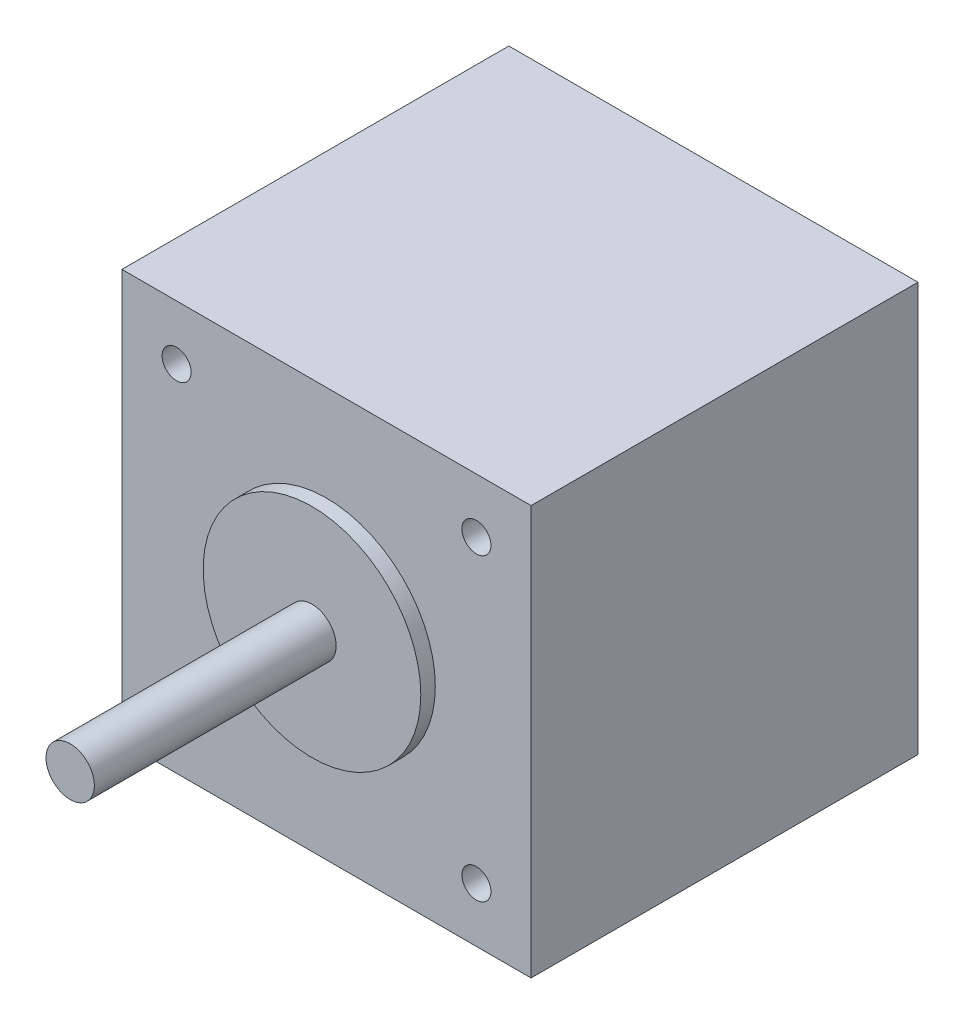
ISO-10303-21;
HEADER;
FILE_DESCRIPTION(('STEP AP214'),'2;1');
FILE_NAME('part.step','',(''),(''),'','','');
FILE_SCHEMA(('AUTOMOTIVE_DESIGN { 1 0 10303 214 1 1 1 1 }'));
ENDSEC;
DATA;
#1=APPLICATION_CONTEXT('core data for automotive mechanical design processes');
#2=APPLICATION_PROTOCOL_DEFINITION('international standard','automotive_design',2000,#1);
#3=PRODUCT_CONTEXT('',#1,'mechanical');
#4=PRODUCT('Part','Part','',(#3));
#5=PRODUCT_RELATED_PRODUCT_CATEGORY('part','',(#4));
#6=PRODUCT_DEFINITION_FORMATION('','',#4);
#7=PRODUCT_DEFINITION_CONTEXT('part definition',#1,'design');
#8=PRODUCT_DEFINITION('design','',#6,#7);
#9=PRODUCT_DEFINITION_SHAPE('','',#8);
#10=(LENGTH_UNIT() NAMED_UNIT(*) SI_UNIT(.MILLI.,.METRE.));
#11=(NAMED_UNIT(*) PLANE_ANGLE_UNIT() SI_UNIT($,.RADIAN.));
#12=(NAMED_UNIT(*) SI_UNIT($,.STERADIAN.) SOLID_ANGLE_UNIT());
#13=UNCERTAINTY_MEASURE_WITH_UNIT(LENGTH_MEASURE(1.E-05),#10,'distance_accuracy_value','');
#14=(GEOMETRIC_REPRESENTATION_CONTEXT(3) GLOBAL_UNCERTAINTY_ASSIGNED_CONTEXT((#13)) GLOBAL_UNIT_ASSIGNED_CONTEXT((#10,
#11,#12)) REPRESENTATION_CONTEXT('',''));
#15=CARTESIAN_POINT('',(0.,0.,0.));
#16=DIRECTION('',(0.,0.,1.));
#17=DIRECTION('',(1.,0.,0.));
#18=AXIS2_PLACEMENT_3D('',#15,#16,#17);
#19=CARTESIAN_POINT('',(-21.15,-21.15,-40.));
#20=DIRECTION('',(0.,-1.,0.));
#21=DIRECTION('',(0.,0.,-1.));
#22=AXIS2_PLACEMENT_3D('',#19,#20,#21);
#23=PLANE('',#22);
#24=DIRECTION('',(0.,0.,-1.));
#25=VECTOR('',#24,1.);
#26=CARTESIAN_POINT('',(-8.5,-21.15,-40.));
#27=LINE('',#26,#25);
#28=CARTESIAN_POINT('',(-8.5,-21.15,-31.));
#29=VERTEX_POINT('',#28);
#30=CARTESIAN_POINT('',(-8.5,-21.15,-40.));
#31=VERTEX_POINT('',#30);
#32=EDGE_CURVE('E50',#29,#31,#27,.T.);
#33=ORIENTED_EDGE('',*,*,#32,.F.);
#34=DIRECTION('',(-1.,0.,0.));
#35=VECTOR('',#34,1.);
#36=CARTESIAN_POINT('',(-8.5,-21.15,-31.));
#37=LINE('',#36,#35);
#38=CARTESIAN_POINT('',(8.5,-21.15,-31.));
#39=VERTEX_POINT('',#38);
#40=EDGE_CURVE('E118',#39,#29,#37,.T.);
#41=ORIENTED_EDGE('',*,*,#40,.F.);
#42=DIRECTION('',(0.,0.,1.));
#43=VECTOR('',#42,1.);
#44=CARTESIAN_POINT('',(8.50000000000001,-21.15,-40.));
#45=LINE('',#44,#43);
#46=CARTESIAN_POINT('',(8.50000000000001,-21.15,-40.));
#47=VERTEX_POINT('',#46);
#48=EDGE_CURVE('E56',#47,#39,#45,.T.);
#49=ORIENTED_EDGE('',*,*,#48,.F.);
#50=DIRECTION('',(1.,0.,0.));
#51=VECTOR('',#50,1.);
#52=CARTESIAN_POINT('',(-21.15,-21.15,-40.));
#53=LINE('',#52,#51);
#54=CARTESIAN_POINT('',(21.15,-21.15,-40.));
#55=VERTEX_POINT('',#54);
#56=EDGE_CURVE('E166',#47,#55,#53,.T.);
#57=ORIENTED_EDGE('',*,*,#56,.T.);
#58=DIRECTION('',(0.,0.,1.));
#59=VECTOR('',#58,1.);
#60=CARTESIAN_POINT('',(21.15,-21.15,-40.));
#61=LINE('',#60,#59);
#62=CARTESIAN_POINT('',(21.15,-21.15,0.));
#63=VERTEX_POINT('',#62);
#64=EDGE_CURVE('E37',#55,#63,#61,.T.);
#65=ORIENTED_EDGE('',*,*,#64,.T.);
#66=DIRECTION('',(1.,0.,0.));
#67=VECTOR('',#66,1.);
#68=CARTESIAN_POINT('',(-21.15,-21.15,0.));
#69=LINE('',#68,#67);
#70=CARTESIAN_POINT('',(-21.15,-21.15,0.));
#71=VERTEX_POINT('',#70);
#72=EDGE_CURVE('E160',#71,#63,#69,.T.);
#73=ORIENTED_EDGE('',*,*,#72,.F.);
#74=DIRECTION('',(0.,0.,1.));
#75=VECTOR('',#74,1.);
#76=CARTESIAN_POINT('',(-21.15,-21.15,-40.));
#77=LINE('',#76,#75);
#78=CARTESIAN_POINT('',(-21.15,-21.15,-40.));
#79=VERTEX_POINT('',#78);
#80=EDGE_CURVE('E11',#79,#71,#77,.T.);
#81=ORIENTED_EDGE('',*,*,#80,.F.);
#82=EDGE_CURVE('E163',#79,#31,#53,.T.);
#83=ORIENTED_EDGE('',*,*,#82,.T.);
#84=EDGE_LOOP('',(#33,#41,#49,#57,#65,#73,#81,#83));
#85=FACE_BOUND('',#84,.T.);
#86=ADVANCED_FACE('F34',(#85),#23,.T.);
#87=CARTESIAN_POINT('',(-21.15,-21.15,-40.));
#88=DIRECTION('',(1.,0.,0.));
#89=DIRECTION('',(0.,0.,-1.));
#90=AXIS2_PLACEMENT_3D('',#87,#88,#89);
#91=PLANE('',#90);
#92=DIRECTION('',(0.,1.,0.));
#93=VECTOR('',#92,1.);
#94=CARTESIAN_POINT('',(-21.15,-21.15,0.));
#95=LINE('',#94,#93);
#96=CARTESIAN_POINT('',(-21.15,21.15,0.));
#97=VERTEX_POINT('',#96);
#98=EDGE_CURVE('E181',#71,#97,#95,.T.);
#99=ORIENTED_EDGE('',*,*,#98,.T.);
#100=DIRECTION('',(0.,0.,1.));
#101=VECTOR('',#100,1.);
#102=CARTESIAN_POINT('',(-21.15,21.15,-40.));
#103=LINE('',#102,#101);
#104=CARTESIAN_POINT('',(-21.15,21.15,-40.));
#105=VERTEX_POINT('',#104);
#106=EDGE_CURVE('E42',#105,#97,#103,.T.);
#107=ORIENTED_EDGE('',*,*,#106,.F.);
#108=DIRECTION('',(0.,1.,0.));
#109=VECTOR('',#108,1.);
#110=CARTESIAN_POINT('',(-21.15,-21.15,-40.));
#111=LINE('',#110,#109);
#112=EDGE_CURVE('E171',#79,#105,#111,.T.);
#113=ORIENTED_EDGE('',*,*,#112,.F.);
#114=ORIENTED_EDGE('',*,*,#80,.T.);
#115=EDGE_LOOP('',(#99,#107,#113,#114));
#116=FACE_BOUND('',#115,.T.);
#117=ADVANCED_FACE('F198',(#116),#91,.F.);
#118=CARTESIAN_POINT('',(-21.15,21.15,-40.));
#119=DIRECTION('',(0.,-1.,0.));
#120=DIRECTION('',(0.,0.,-1.));
#121=AXIS2_PLACEMENT_3D('',#118,#119,#120);
#122=PLANE('',#121);
#123=DIRECTION('',(1.,0.,0.));
#124=VECTOR('',#123,1.);
#125=CARTESIAN_POINT('',(-21.15,21.15,0.));
#126=LINE('',#125,#124);
#127=CARTESIAN_POINT('',(21.15,21.15,0.));
#128=VERTEX_POINT('',#127);
#129=EDGE_CURVE('E178',#97,#128,#126,.T.);
#130=ORIENTED_EDGE('',*,*,#129,.T.);
#131=DIRECTION('',(0.,0.,1.));
#132=VECTOR('',#131,1.);
#133=CARTESIAN_POINT('',(21.15,21.15,-40.));
#134=LINE('',#133,#132);
#135=CARTESIAN_POINT('',(21.15,21.15,-40.));
#136=VERTEX_POINT('',#135);
#137=EDGE_CURVE('E184',#136,#128,#134,.T.);
#138=ORIENTED_EDGE('',*,*,#137,.F.);
#139=DIRECTION('',(1.,0.,0.));
#140=VECTOR('',#139,1.);
#141=CARTESIAN_POINT('',(-21.15,21.15,-40.));
#142=LINE('',#141,#140);
#143=EDGE_CURVE('E169',#105,#136,#142,.T.);
#144=ORIENTED_EDGE('',*,*,#143,.F.);
#145=ORIENTED_EDGE('',*,*,#106,.T.);
#146=EDGE_LOOP('',(#130,#138,#144,#145));
#147=FACE_BOUND('',#146,.T.);
#148=ADVANCED_FACE('F202',(#147),#122,.F.);
#149=CARTESIAN_POINT('',(21.15,-21.15,-40.));
#150=DIRECTION('',(1.,0.,0.));
#151=DIRECTION('',(0.,0.,-1.));
#152=AXIS2_PLACEMENT_3D('',#149,#150,#151);
#153=PLANE('',#152);
#154=DIRECTION('',(0.,1.,0.));
#155=VECTOR('',#154,1.);
#156=CARTESIAN_POINT('',(21.15,-21.15,0.));
#157=LINE('',#156,#155);
#158=EDGE_CURVE('E175',#63,#128,#157,.T.);
#159=ORIENTED_EDGE('',*,*,#158,.F.);
#160=ORIENTED_EDGE('',*,*,#64,.F.);
#161=DIRECTION('',(0.,1.,0.));
#162=VECTOR('',#161,1.);
#163=CARTESIAN_POINT('',(21.15,-21.15,-40.));
#164=LINE('',#163,#162);
#165=EDGE_CURVE('E165',#55,#136,#164,.T.);
#166=ORIENTED_EDGE('',*,*,#165,.T.);
#167=ORIENTED_EDGE('',*,*,#137,.T.);
#168=EDGE_LOOP('',(#159,#160,#166,#167));
#169=FACE_BOUND('',#168,.T.);
#170=ADVANCED_FACE('F191',(#169),#153,.T.);
#171=CARTESIAN_POINT('',(0.,0.,-40.));
#172=DIRECTION('',(0.,0.,1.));
#173=DIRECTION('',(1.,0.,0.));
#174=AXIS2_PLACEMENT_3D('',#171,#172,#173);
#175=PLANE('',#174);
#176=ORIENTED_EDGE('',*,*,#82,.F.);
#177=ORIENTED_EDGE('',*,*,#112,.T.);
#178=ORIENTED_EDGE('',*,*,#143,.T.);
#179=ORIENTED_EDGE('',*,*,#165,.F.);
#180=ORIENTED_EDGE('',*,*,#56,.F.);
#181=DIRECTION('',(0.,1.,0.));
#182=VECTOR('',#181,1.);
#183=CARTESIAN_POINT('',(8.50000000000001,-26.15,-40.));
#184=LINE('',#183,#182);
#185=CARTESIAN_POINT('',(8.50000000000001,-26.15,-40.));
#186=VERTEX_POINT('',#185);
#187=EDGE_CURVE('E105',#186,#47,#184,.T.);
#188=ORIENTED_EDGE('',*,*,#187,.F.);
#189=DIRECTION('',(1.,0.,0.));
#190=VECTOR('',#189,1.);
#191=CARTESIAN_POINT('',(-8.5,-26.15,-40.));
#192=LINE('',#191,#190);
#193=CARTESIAN_POINT('',(-8.5,-26.15,-40.));
#194=VERTEX_POINT('',#193);
#195=EDGE_CURVE('E98',#194,#186,#192,.T.);
#196=ORIENTED_EDGE('',*,*,#195,.F.);
#197=DIRECTION('',(0.,1.,0.));
#198=VECTOR('',#197,1.);
#199=CARTESIAN_POINT('',(-8.5,-26.15,-40.));
#200=LINE('',#199,#198);
#201=EDGE_CURVE('E103',#194,#31,#200,.T.);
#202=ORIENTED_EDGE('',*,*,#201,.T.);
#203=EDGE_LOOP('',(#176,#177,#178,#179,#180,#188,#196,#202));
#204=FACE_BOUND('',#203,.T.);
#205=ADVANCED_FACE('F101',(#204),#175,.F.);
#206=CARTESIAN_POINT('',(0.,0.,0.));
#207=DIRECTION('',(0.,0.,1.));
#208=DIRECTION('',(1.,0.,0.));
#209=AXIS2_PLACEMENT_3D('',#206,#207,#208);
#210=PLANE('',#209);
#211=CARTESIAN_POINT('',(0.,0.,0.));
#212=DIRECTION('',(0.,0.,1.));
#213=DIRECTION('',(1.,0.,0.));
#214=AXIS2_PLACEMENT_3D('',#211,#212,#213);
#215=CIRCLE('',#214,11.25);
#216=CARTESIAN_POINT('',(11.25,0.,0.));
#217=VERTEX_POINT('',#216);
#218=EDGE_CURVE('E124',#217,#217,#215,.T.);
#219=ORIENTED_EDGE('',*,*,#218,.F.);
#220=EDGE_LOOP('',(#219));
#221=FACE_BOUND('',#220,.T.);
#222=CARTESIAN_POINT('',(-15.5000000000001,15.5,0.));
#223=DIRECTION('',(0.,0.,1.));
#224=DIRECTION('',(1.,0.,0.));
#225=AXIS2_PLACEMENT_3D('',#222,#223,#224);
#226=CIRCLE('',#225,1.5);
#227=CARTESIAN_POINT('',(-14.0000000000001,15.5,0.));
#228=VERTEX_POINT('',#227);
#229=EDGE_CURVE('E152',#228,#228,#226,.T.);
#230=ORIENTED_EDGE('',*,*,#229,.F.);
#231=EDGE_LOOP('',(#230));
#232=FACE_BOUND('',#231,.T.);
#233=CARTESIAN_POINT('',(15.5,-15.5,0.));
#234=DIRECTION('',(0.,0.,1.));
#235=DIRECTION('',(1.,0.,0.));
#236=AXIS2_PLACEMENT_3D('',#233,#234,#235);
#237=CIRCLE('',#236,1.5);
#238=CARTESIAN_POINT('',(17.,-15.5,0.));
#239=VERTEX_POINT('',#238);
#240=EDGE_CURVE('E146',#239,#239,#237,.T.);
#241=ORIENTED_EDGE('',*,*,#240,.F.);
#242=EDGE_LOOP('',(#241));
#243=FACE_BOUND('',#242,.T.);
#244=CARTESIAN_POINT('',(15.5,15.5,0.));
#245=DIRECTION('',(0.,0.,1.));
#246=DIRECTION('',(1.,0.,0.));
#247=AXIS2_PLACEMENT_3D('',#244,#245,#246);
#248=CIRCLE('',#247,1.5);
#249=CARTESIAN_POINT('',(17.,15.5,0.));
#250=VERTEX_POINT('',#249);
#251=EDGE_CURVE('E139',#250,#250,#248,.T.);
#252=ORIENTED_EDGE('',*,*,#251,.F.);
#253=EDGE_LOOP('',(#252));
#254=FACE_BOUND('',#253,.T.);
#255=CARTESIAN_POINT('',(-15.5000000000001,-15.5000000000001,0.));
#256=DIRECTION('',(0.,0.,1.));
#257=DIRECTION('',(1.,0.,0.));
#258=AXIS2_PLACEMENT_3D('',#255,#256,#257);
#259=CIRCLE('',#258,1.5);
#260=CARTESIAN_POINT('',(-14.0000000000001,-15.5000000000001,0.));
#261=VERTEX_POINT('',#260);
#262=EDGE_CURVE('E142',#261,#261,#259,.T.);
#263=ORIENTED_EDGE('',*,*,#262,.F.);
#264=EDGE_LOOP('',(#263));
#265=FACE_BOUND('',#264,.T.);
#266=ORIENTED_EDGE('',*,*,#72,.T.);
#267=ORIENTED_EDGE('',*,*,#158,.T.);
#268=ORIENTED_EDGE('',*,*,#129,.F.);
#269=ORIENTED_EDGE('',*,*,#98,.F.);
#270=EDGE_LOOP('',(#266,#267,#268,#269));
#271=FACE_BOUND('',#270,.T.);
#272=ADVANCED_FACE('F195',(#221,#232,#243,#254,#265,#271),#210,.T.);
#273=CARTESIAN_POINT('',(-15.5000000000001,-15.5000000000001,-5.));
#274=DIRECTION('',(0.,0.,1.));
#275=DIRECTION('',(1.,0.,0.));
#276=AXIS2_PLACEMENT_3D('',#273,#274,#275);
#277=CYLINDRICAL_SURFACE('',#276,1.5);
#278=CARTESIAN_POINT('',(-15.5000000000001,-15.5000000000001,-5.));
#279=DIRECTION('',(0.,0.,1.));
#280=DIRECTION('',(1.,0.,0.));
#281=AXIS2_PLACEMENT_3D('',#278,#279,#280);
#282=CIRCLE('',#281,1.5);
#283=CARTESIAN_POINT('',(-14.0000000000001,-15.5000000000001,-5.));
#284=VERTEX_POINT('',#283);
#285=EDGE_CURVE('E157',#284,#284,#282,.T.);
#286=ORIENTED_EDGE('',*,*,#285,.F.);
#287=EDGE_LOOP('',(#286));
#288=FACE_BOUND('',#287,.T.);
#289=ORIENTED_EDGE('',*,*,#262,.T.);
#290=EDGE_LOOP('',(#289));
#291=FACE_BOUND('',#290,.T.);
#292=ADVANCED_FACE('F242',(#288,#291),#277,.F.);
#293=CARTESIAN_POINT('',(0.,0.,-5.));
#294=DIRECTION('',(0.,0.,1.));
#295=DIRECTION('',(1.,0.,0.));
#296=AXIS2_PLACEMENT_3D('',#293,#294,#295);
#297=PLANE('',#296);
#298=ORIENTED_EDGE('',*,*,#285,.T.);
#299=EDGE_LOOP('',(#298));
#300=FACE_BOUND('',#299,.T.);
#301=ADVANCED_FACE('F247',(#300),#297,.T.);
#302=CARTESIAN_POINT('',(15.5,15.5,-5.));
#303=DIRECTION('',(0.,0.,1.));
#304=DIRECTION('',(1.,0.,0.));
#305=AXIS2_PLACEMENT_3D('',#302,#303,#304);
#306=CYLINDRICAL_SURFACE('',#305,1.5);
#307=CARTESIAN_POINT('',(15.5,15.5,-5.));
#308=DIRECTION('',(0.,0.,1.));
#309=DIRECTION('',(1.,0.,0.));
#310=AXIS2_PLACEMENT_3D('',#307,#308,#309);
#311=CIRCLE('',#310,1.5);
#312=CARTESIAN_POINT('',(17.,15.5,-5.));
#313=VERTEX_POINT('',#312);
#314=EDGE_CURVE('E143',#313,#313,#311,.T.);
#315=ORIENTED_EDGE('',*,*,#314,.F.);
#316=EDGE_LOOP('',(#315));
#317=FACE_BOUND('',#316,.T.);
#318=ORIENTED_EDGE('',*,*,#251,.T.);
#319=EDGE_LOOP('',(#318));
#320=FACE_BOUND('',#319,.T.);
#321=ADVANCED_FACE('F251',(#317,#320),#306,.F.);
#322=CARTESIAN_POINT('',(0.,0.,-5.));
#323=DIRECTION('',(0.,0.,1.));
#324=DIRECTION('',(1.,0.,0.));
#325=AXIS2_PLACEMENT_3D('',#322,#323,#324);
#326=PLANE('',#325);
#327=ORIENTED_EDGE('',*,*,#314,.T.);
#328=EDGE_LOOP('',(#327));
#329=FACE_BOUND('',#328,.T.);
#330=ADVANCED_FACE('F269',(#329),#326,.T.);
#331=CARTESIAN_POINT('',(15.5,-15.5,-5.));
#332=DIRECTION('',(0.,0.,1.));
#333=DIRECTION('',(1.,0.,0.));
#334=AXIS2_PLACEMENT_3D('',#331,#332,#333);
#335=CYLINDRICAL_SURFACE('',#334,1.5);
#336=CARTESIAN_POINT('',(15.5,-15.5,-5.));
#337=DIRECTION('',(0.,0.,1.));
#338=DIRECTION('',(1.,0.,0.));
#339=AXIS2_PLACEMENT_3D('',#336,#337,#338);
#340=CIRCLE('',#339,1.5);
#341=CARTESIAN_POINT('',(17.,-15.5,-5.));
#342=VERTEX_POINT('',#341);
#343=EDGE_CURVE('E149',#342,#342,#340,.T.);
#344=ORIENTED_EDGE('',*,*,#343,.F.);
#345=EDGE_LOOP('',(#344));
#346=FACE_BOUND('',#345,.T.);
#347=ORIENTED_EDGE('',*,*,#240,.T.);
#348=EDGE_LOOP('',(#347));
#349=FACE_BOUND('',#348,.T.);
#350=ADVANCED_FACE('F265',(#346,#349),#335,.F.);
#351=CARTESIAN_POINT('',(0.,0.,-5.));
#352=DIRECTION('',(0.,0.,1.));
#353=DIRECTION('',(1.,0.,0.));
#354=AXIS2_PLACEMENT_3D('',#351,#352,#353);
#355=PLANE('',#354);
#356=ORIENTED_EDGE('',*,*,#343,.T.);
#357=EDGE_LOOP('',(#356));
#358=FACE_BOUND('',#357,.T.);
#359=ADVANCED_FACE('F261',(#358),#355,.T.);
#360=CARTESIAN_POINT('',(-15.5000000000001,15.5,-5.));
#361=DIRECTION('',(0.,0.,1.));
#362=DIRECTION('',(1.,0.,0.));
#363=AXIS2_PLACEMENT_3D('',#360,#361,#362);
#364=CYLINDRICAL_SURFACE('',#363,1.5);
#365=CARTESIAN_POINT('',(-15.5000000000001,15.5,-5.));
#366=DIRECTION('',(0.,0.,1.));
#367=DIRECTION('',(1.,0.,0.));
#368=AXIS2_PLACEMENT_3D('',#365,#366,#367);
#369=CIRCLE('',#368,1.5);
#370=CARTESIAN_POINT('',(-14.0000000000001,15.5,-5.));
#371=VERTEX_POINT('',#370);
#372=EDGE_CURVE('E136',#371,#371,#369,.T.);
#373=ORIENTED_EDGE('',*,*,#372,.F.);
#374=EDGE_LOOP('',(#373));
#375=FACE_BOUND('',#374,.T.);
#376=ORIENTED_EDGE('',*,*,#229,.T.);
#377=EDGE_LOOP('',(#376));
#378=FACE_BOUND('',#377,.T.);
#379=ADVANCED_FACE('F257',(#375,#378),#364,.F.);
#380=CARTESIAN_POINT('',(-15.5000000000001,15.5,-5.));
#381=DIRECTION('',(0.,0.,1.));
#382=DIRECTION('',(1.,0.,0.));
#383=AXIS2_PLACEMENT_3D('',#380,#381,#382);
#384=PLANE('',#383);
#385=ORIENTED_EDGE('',*,*,#372,.T.);
#386=EDGE_LOOP('',(#385));
#387=FACE_BOUND('',#386,.T.);
#388=ADVANCED_FACE('F253',(#387),#384,.T.);
#389=CARTESIAN_POINT('',(0.,0.,1.5));
#390=DIRECTION('',(0.,0.,-1.));
#391=DIRECTION('',(-1.,0.,0.));
#392=AXIS2_PLACEMENT_3D('',#389,#390,#391);
#393=CYLINDRICAL_SURFACE('',#392,11.25);
#394=CARTESIAN_POINT('',(0.,0.,1.5));
#395=DIRECTION('',(0.,0.,1.));
#396=DIRECTION('',(1.,0.,0.));
#397=AXIS2_PLACEMENT_3D('',#394,#395,#396);
#398=CIRCLE('',#397,11.25);
#399=CARTESIAN_POINT('',(11.25,0.,1.5));
#400=VERTEX_POINT('',#399);
#401=EDGE_CURVE('E133',#400,#400,#398,.T.);
#402=ORIENTED_EDGE('',*,*,#401,.F.);
#403=EDGE_LOOP('',(#402));
#404=FACE_BOUND('',#403,.T.);
#405=ORIENTED_EDGE('',*,*,#218,.T.);
#406=EDGE_LOOP('',(#405));
#407=FACE_BOUND('',#406,.T.);
#408=ADVANCED_FACE('F256',(#404,#407),#393,.T.);
#409=CARTESIAN_POINT('',(0.,0.,1.5));
#410=DIRECTION('',(0.,0.,1.));
#411=DIRECTION('',(1.,0.,0.));
#412=AXIS2_PLACEMENT_3D('',#409,#410,#411);
#413=PLANE('',#412);
#414=CARTESIAN_POINT('',(0.,0.,1.5));
#415=DIRECTION('',(0.,0.,1.));
#416=DIRECTION('',(1.,0.,0.));
#417=AXIS2_PLACEMENT_3D('',#414,#415,#416);
#418=CIRCLE('',#417,2.5);
#419=CARTESIAN_POINT('',(2.5,0.,1.5));
#420=VERTEX_POINT('',#419);
#421=EDGE_CURVE('E130',#420,#420,#418,.T.);
#422=ORIENTED_EDGE('',*,*,#421,.F.);
#423=EDGE_LOOP('',(#422));
#424=FACE_BOUND('',#423,.T.);
#425=ORIENTED_EDGE('',*,*,#401,.T.);
#426=EDGE_LOOP('',(#425));
#427=FACE_BOUND('',#426,.T.);
#428=ADVANCED_FACE('F279',(#424,#427),#413,.T.);
#429=CARTESIAN_POINT('',(0.,0.,-7.07106781186548));
#430=DIRECTION('',(0.,0.,1.));
#431=DIRECTION('',(1.,0.,0.));
#432=AXIS2_PLACEMENT_3D('',#429,#430,#431);
#433=CYLINDRICAL_SURFACE('',#432,2.5);
#434=ORIENTED_EDGE('',*,*,#421,.T.);
#435=EDGE_LOOP('',(#434));
#436=FACE_BOUND('',#435,.T.);
#437=CARTESIAN_POINT('',(0.,0.,26.5));
#438=DIRECTION('',(0.,0.,1.));
#439=DIRECTION('',(1.,0.,0.));
#440=AXIS2_PLACEMENT_3D('',#437,#438,#439);
#441=CIRCLE('',#440,2.5);
#442=CARTESIAN_POINT('',(2.5,0.,26.5));
#443=VERTEX_POINT('',#442);
#444=EDGE_CURVE('E121',#443,#443,#441,.T.);
#445=ORIENTED_EDGE('',*,*,#444,.F.);
#446=EDGE_LOOP('',(#445));
#447=FACE_BOUND('',#446,.T.);
#448=ADVANCED_FACE('F283',(#436,#447),#433,.T.);
#449=CARTESIAN_POINT('',(0.,0.,26.5));
#450=DIRECTION('',(0.,0.,1.));
#451=DIRECTION('',(1.,0.,0.));
#452=AXIS2_PLACEMENT_3D('',#449,#450,#451);
#453=PLANE('',#452);
#454=ORIENTED_EDGE('',*,*,#444,.T.);
#455=EDGE_LOOP('',(#454));
#456=FACE_BOUND('',#455,.T.);
#457=ADVANCED_FACE('F287',(#456),#453,.T.);
#458=CARTESIAN_POINT('',(-8.5,-26.15,-40.));
#459=DIRECTION('',(1.,0.,0.));
#460=DIRECTION('',(0.,0.,-1.));
#461=AXIS2_PLACEMENT_3D('',#458,#459,#460);
#462=PLANE('',#461);
#463=ORIENTED_EDGE('',*,*,#32,.T.);
#464=ORIENTED_EDGE('',*,*,#201,.F.);
#465=DIRECTION('',(0.,0.,-1.));
#466=VECTOR('',#465,1.);
#467=CARTESIAN_POINT('',(-8.5,-26.15,-40.));
#468=LINE('',#467,#466);
#469=CARTESIAN_POINT('',(-8.5,-26.15,-31.));
#470=VERTEX_POINT('',#469);
#471=EDGE_CURVE('E109',#470,#194,#468,.T.);
#472=ORIENTED_EDGE('',*,*,#471,.F.);
#473=DIRECTION('',(0.,1.,0.));
#474=VECTOR('',#473,1.);
#475=CARTESIAN_POINT('',(-8.5,-26.15,-31.));
#476=LINE('',#475,#474);
#477=EDGE_CURVE('E208',#470,#29,#476,.T.);
#478=ORIENTED_EDGE('',*,*,#477,.T.);
#479=EDGE_LOOP('',(#463,#464,#472,#478));
#480=FACE_BOUND('',#479,.T.);
#481=ADVANCED_FACE('F120',(#480),#462,.F.);
#482=CARTESIAN_POINT('',(8.50000000000001,-26.15,-40.));
#483=DIRECTION('',(-1.,0.,0.));
#484=DIRECTION('',(0.,0.,1.));
#485=AXIS2_PLACEMENT_3D('',#482,#483,#484);
#486=PLANE('',#485);
#487=ORIENTED_EDGE('',*,*,#48,.T.);
#488=DIRECTION('',(0.,1.,0.));
#489=VECTOR('',#488,1.);
#490=CARTESIAN_POINT('',(8.5,-26.15,-31.));
#491=LINE('',#490,#489);
#492=CARTESIAN_POINT('',(8.5,-26.15,-31.));
#493=VERTEX_POINT('',#492);
#494=EDGE_CURVE('E126',#493,#39,#491,.T.);
#495=ORIENTED_EDGE('',*,*,#494,.F.);
#496=DIRECTION('',(0.,0.,1.));
#497=VECTOR('',#496,1.);
#498=CARTESIAN_POINT('',(8.50000000000001,-26.15,-40.));
#499=LINE('',#498,#497);
#500=EDGE_CURVE('E108',#186,#493,#499,.T.);
#501=ORIENTED_EDGE('',*,*,#500,.F.);
#502=ORIENTED_EDGE('',*,*,#187,.T.);
#503=EDGE_LOOP('',(#487,#495,#501,#502));
#504=FACE_BOUND('',#503,.T.);
#505=ADVANCED_FACE('F204',(#504),#486,.F.);
#506=CARTESIAN_POINT('',(-8.5,-26.15,-31.));
#507=DIRECTION('',(0.,0.,-1.));
#508=DIRECTION('',(-1.,0.,0.));
#509=AXIS2_PLACEMENT_3D('',#506,#507,#508);
#510=PLANE('',#509);
#511=ORIENTED_EDGE('',*,*,#40,.T.);
#512=ORIENTED_EDGE('',*,*,#477,.F.);
#513=DIRECTION('',(-1.,0.,0.));
#514=VECTOR('',#513,1.);
#515=CARTESIAN_POINT('',(-8.5,-26.15,-31.));
#516=LINE('',#515,#514);
#517=EDGE_CURVE('E114',#493,#470,#516,.T.);
#518=ORIENTED_EDGE('',*,*,#517,.F.);
#519=ORIENTED_EDGE('',*,*,#494,.T.);
#520=EDGE_LOOP('',(#511,#512,#518,#519));
#521=FACE_BOUND('',#520,.T.);
#522=ADVANCED_FACE('F215',(#521),#510,.F.);
#523=CARTESIAN_POINT('',(0.,-26.15,0.));
#524=DIRECTION('',(0.,1.,0.));
#525=DIRECTION('',(0.,0.,1.));
#526=AXIS2_PLACEMENT_3D('',#523,#524,#525);
#527=PLANE('',#526);
#528=ORIENTED_EDGE('',*,*,#471,.T.);
#529=ORIENTED_EDGE('',*,*,#195,.T.);
#530=ORIENTED_EDGE('',*,*,#500,.T.);
#531=ORIENTED_EDGE('',*,*,#517,.T.);
#532=EDGE_LOOP('',(#528,#529,#530,#531));
#533=FACE_BOUND('',#532,.T.);
#534=ADVANCED_FACE('F112',(#533),#527,.F.);
#535=CLOSED_SHELL('',(#86,#117,#148,#170,#205,#272,#292,#301,#321,#330,#350,#359,#379,#388,#408,
#428,#448,#457,#481,#505,#522,#534));
#536=MANIFOLD_SOLID_BREP('B2',#535);
#537=ADVANCED_BREP_SHAPE_REPRESENTATION('',(#18,#536),#14);
#538=SHAPE_DEFINITION_REPRESENTATION(#9,#537);
ENDSEC;
END-ISO-10303-21;
